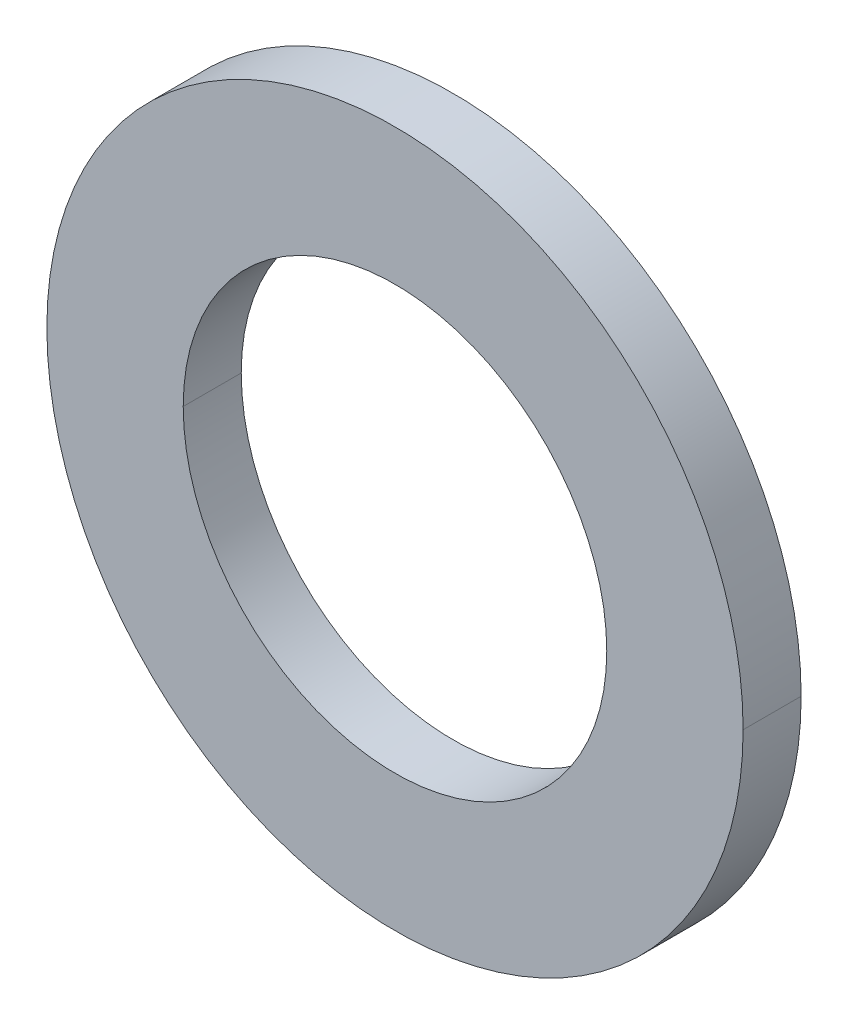
ISO-10303-21;
HEADER;
FILE_DESCRIPTION(('STEP AP214'),'2;1');
FILE_NAME('part.step','',(''),(''),'','','');
FILE_SCHEMA(('AUTOMOTIVE_DESIGN { 1 0 10303 214 1 1 1 1 }'));
ENDSEC;
DATA;
#1=APPLICATION_CONTEXT('core data for automotive mechanical design processes');
#2=APPLICATION_PROTOCOL_DEFINITION('international standard','automotive_design',2000,#1);
#3=PRODUCT_CONTEXT('',#1,'mechanical');
#4=PRODUCT('Part','Part','',(#3));
#5=PRODUCT_RELATED_PRODUCT_CATEGORY('part','',(#4));
#6=PRODUCT_DEFINITION_FORMATION('','',#4);
#7=PRODUCT_DEFINITION_CONTEXT('part definition',#1,'design');
#8=PRODUCT_DEFINITION('design','',#6,#7);
#9=PRODUCT_DEFINITION_SHAPE('','',#8);
#10=(LENGTH_UNIT() NAMED_UNIT(*) SI_UNIT(.MILLI.,.METRE.));
#11=(NAMED_UNIT(*) PLANE_ANGLE_UNIT() SI_UNIT($,.RADIAN.));
#12=(NAMED_UNIT(*) SI_UNIT($,.STERADIAN.) SOLID_ANGLE_UNIT());
#13=UNCERTAINTY_MEASURE_WITH_UNIT(LENGTH_MEASURE(1.E-05),#10,'distance_accuracy_value','');
#14=(GEOMETRIC_REPRESENTATION_CONTEXT(3) GLOBAL_UNCERTAINTY_ASSIGNED_CONTEXT((#13)) GLOBAL_UNIT_ASSIGNED_CONTEXT((#10,
#11,#12)) REPRESENTATION_CONTEXT('',''));
#15=CARTESIAN_POINT('',(0.,0.,0.));
#16=DIRECTION('',(0.,0.,1.));
#17=DIRECTION('',(1.,0.,0.));
#18=AXIS2_PLACEMENT_3D('',#15,#16,#17);
#19=CARTESIAN_POINT('',(-16.64701983,-23.770532578,1.));
#20=DIRECTION('',(0.,0.,1.));
#21=DIRECTION('',(1.,0.,0.));
#22=AXIS2_PLACEMENT_3D('',#19,#20,#21);
#23=PLANE('',#22);
#24=CARTESIAN_POINT('',(-11.08101983,-18.204532578,1.));
#25=DIRECTION('',(0.,0.,1.));
#26=DIRECTION('',(1.,0.,0.));
#27=AXIS2_PLACEMENT_3D('',#24,#25,#26);
#28=CIRCLE('',#27,3.65);
#29=CARTESIAN_POINT('',(-7.43101983,-18.204532578,1.));
#30=VERTEX_POINT('',#29);
#31=CARTESIAN_POINT('',(-14.73101983,-18.204532578,1.));
#32=VERTEX_POINT('',#31);
#33=EDGE_CURVE('E75',#30,#32,#28,.F.);
#34=ORIENTED_EDGE('',*,*,#33,.T.);
#35=CARTESIAN_POINT('',(-11.08101983,-18.204532578,1.));
#36=DIRECTION('',(0.,0.,1.));
#37=DIRECTION('',(1.,0.,0.));
#38=AXIS2_PLACEMENT_3D('',#35,#36,#37);
#39=CIRCLE('',#38,3.65);
#40=EDGE_CURVE('E71',#32,#30,#39,.F.);
#41=ORIENTED_EDGE('',*,*,#40,.T.);
#42=EDGE_LOOP('',(#34,#41));
#43=FACE_BOUND('',#42,.T.);
#44=CARTESIAN_POINT('',(-11.08101983,-18.204532578,1.));
#45=DIRECTION('',(0.,0.,1.));
#46=DIRECTION('',(1.,0.,0.));
#47=AXIS2_PLACEMENT_3D('',#44,#45,#46);
#48=CIRCLE('',#47,6.);
#49=CARTESIAN_POINT('',(-5.08101983,-18.204532578,1.));
#50=VERTEX_POINT('',#49);
#51=CARTESIAN_POINT('',(-17.08101983,-18.204532578,1.));
#52=VERTEX_POINT('',#51);
#53=EDGE_CURVE('E55',#50,#52,#48,.F.);
#54=ORIENTED_EDGE('',*,*,#53,.F.);
#55=CARTESIAN_POINT('',(-11.08101983,-18.204532578,1.));
#56=DIRECTION('',(0.,0.,1.));
#57=DIRECTION('',(1.,0.,0.));
#58=AXIS2_PLACEMENT_3D('',#55,#56,#57);
#59=CIRCLE('',#58,6.);
#60=EDGE_CURVE('E20',#52,#50,#59,.F.);
#61=ORIENTED_EDGE('',*,*,#60,.F.);
#62=EDGE_LOOP('',(#54,#61));
#63=FACE_BOUND('',#62,.T.);
#64=ADVANCED_FACE('F17',(#43,#63),#23,.T.);
#65=CARTESIAN_POINT('',(-11.08101983,-18.204532578,0.));
#66=DIRECTION('',(0.,0.,1.));
#67=DIRECTION('',(1.,0.,0.));
#68=AXIS2_PLACEMENT_3D('',#65,#66,#67);
#69=CYLINDRICAL_SURFACE('',#68,6.);
#70=DIRECTION('',(0.,0.,1.));
#71=VECTOR('',#70,1.);
#72=CARTESIAN_POINT('',(-5.08101983,-18.204532578,0.));
#73=LINE('',#72,#71);
#74=CARTESIAN_POINT('',(-5.08101983,-18.204532578,0.));
#75=VERTEX_POINT('',#74);
#76=EDGE_CURVE('E63',#75,#50,#73,.T.);
#77=ORIENTED_EDGE('',*,*,#76,.F.);
#78=CARTESIAN_POINT('',(-11.08101983,-18.204532578,0.));
#79=DIRECTION('',(0.,0.,1.));
#80=DIRECTION('',(1.,0.,0.));
#81=AXIS2_PLACEMENT_3D('',#78,#79,#80);
#82=CIRCLE('',#81,6.);
#83=CARTESIAN_POINT('',(-17.08101983,-18.204532578,0.));
#84=VERTEX_POINT('',#83);
#85=EDGE_CURVE('E79',#75,#84,#82,.T.);
#86=ORIENTED_EDGE('',*,*,#85,.T.);
#87=DIRECTION('',(0.,0.,1.));
#88=VECTOR('',#87,1.);
#89=CARTESIAN_POINT('',(-17.08101983,-18.204532578,0.));
#90=LINE('',#89,#88);
#91=EDGE_CURVE('E65',#52,#84,#90,.F.);
#92=ORIENTED_EDGE('',*,*,#91,.F.);
#93=ORIENTED_EDGE('',*,*,#60,.T.);
#94=EDGE_LOOP('',(#77,#86,#92,#93));
#95=FACE_BOUND('',#94,.T.);
#96=ADVANCED_FACE('F61',(#95),#69,.T.);
#97=CARTESIAN_POINT('',(-11.08101983,-18.204532578,0.));
#98=DIRECTION('',(0.,0.,1.));
#99=DIRECTION('',(1.,0.,0.));
#100=AXIS2_PLACEMENT_3D('',#97,#98,#99);
#101=CYLINDRICAL_SURFACE('',#100,6.);
#102=ORIENTED_EDGE('',*,*,#53,.T.);
#103=ORIENTED_EDGE('',*,*,#91,.T.);
#104=CARTESIAN_POINT('',(-11.08101983,-18.204532578,0.));
#105=DIRECTION('',(0.,0.,1.));
#106=DIRECTION('',(1.,0.,0.));
#107=AXIS2_PLACEMENT_3D('',#104,#105,#106);
#108=CIRCLE('',#107,6.);
#109=EDGE_CURVE('E69',#84,#75,#108,.T.);
#110=ORIENTED_EDGE('',*,*,#109,.T.);
#111=ORIENTED_EDGE('',*,*,#76,.T.);
#112=EDGE_LOOP('',(#102,#103,#110,#111));
#113=FACE_BOUND('',#112,.T.);
#114=ADVANCED_FACE('F67',(#113),#101,.T.);
#115=CARTESIAN_POINT('',(-11.08101983,-18.204532578,0.));
#116=DIRECTION('',(0.,0.,1.));
#117=DIRECTION('',(1.,0.,0.));
#118=AXIS2_PLACEMENT_3D('',#115,#116,#117);
#119=CYLINDRICAL_SURFACE('',#118,3.65);
#120=DIRECTION('',(0.,0.,1.));
#121=VECTOR('',#120,1.);
#122=CARTESIAN_POINT('',(-7.43101983,-18.204532578,0.));
#123=LINE('',#122,#121);
#124=CARTESIAN_POINT('',(-7.43101983,-18.204532578,0.));
#125=VERTEX_POINT('',#124);
#126=EDGE_CURVE('E34',#125,#30,#123,.T.);
#127=ORIENTED_EDGE('',*,*,#126,.T.);
#128=ORIENTED_EDGE('',*,*,#40,.F.);
#129=DIRECTION('',(0.,0.,1.));
#130=VECTOR('',#129,1.);
#131=CARTESIAN_POINT('',(-14.73101983,-18.204532578,0.));
#132=LINE('',#131,#130);
#133=CARTESIAN_POINT('',(-14.73101983,-18.204532578,0.));
#134=VERTEX_POINT('',#133);
#135=EDGE_CURVE('E78',#32,#134,#132,.F.);
#136=ORIENTED_EDGE('',*,*,#135,.T.);
#137=CARTESIAN_POINT('',(-11.08101983,-18.204532578,0.));
#138=DIRECTION('',(0.,0.,1.));
#139=DIRECTION('',(1.,0.,0.));
#140=AXIS2_PLACEMENT_3D('',#137,#138,#139);
#141=CIRCLE('',#140,3.65);
#142=EDGE_CURVE('E26',#134,#125,#141,.F.);
#143=ORIENTED_EDGE('',*,*,#142,.T.);
#144=EDGE_LOOP('',(#127,#128,#136,#143));
#145=FACE_BOUND('',#144,.T.);
#146=ADVANCED_FACE('F88',(#145),#119,.F.);
#147=CARTESIAN_POINT('',(-11.08101983,-18.204532578,0.));
#148=DIRECTION('',(0.,0.,1.));
#149=DIRECTION('',(1.,0.,0.));
#150=AXIS2_PLACEMENT_3D('',#147,#148,#149);
#151=CYLINDRICAL_SURFACE('',#150,3.65);
#152=ORIENTED_EDGE('',*,*,#33,.F.);
#153=ORIENTED_EDGE('',*,*,#126,.F.);
#154=CARTESIAN_POINT('',(-11.08101983,-18.204532578,0.));
#155=DIRECTION('',(0.,0.,1.));
#156=DIRECTION('',(1.,0.,0.));
#157=AXIS2_PLACEMENT_3D('',#154,#155,#156);
#158=CIRCLE('',#157,3.65);
#159=EDGE_CURVE('E11',#125,#134,#158,.F.);
#160=ORIENTED_EDGE('',*,*,#159,.T.);
#161=ORIENTED_EDGE('',*,*,#135,.F.);
#162=EDGE_LOOP('',(#152,#153,#160,#161));
#163=FACE_BOUND('',#162,.T.);
#164=ADVANCED_FACE('F89',(#163),#151,.F.);
#165=CARTESIAN_POINT('',(-16.64701983,-23.770532578,0.));
#166=DIRECTION('',(0.,0.,1.));
#167=DIRECTION('',(1.,0.,0.));
#168=AXIS2_PLACEMENT_3D('',#165,#166,#167);
#169=PLANE('',#168);
#170=ORIENTED_EDGE('',*,*,#142,.F.);
#171=ORIENTED_EDGE('',*,*,#159,.F.);
#172=EDGE_LOOP('',(#170,#171));
#173=FACE_BOUND('',#172,.T.);
#174=ORIENTED_EDGE('',*,*,#85,.F.);
#175=ORIENTED_EDGE('',*,*,#109,.F.);
#176=EDGE_LOOP('',(#174,#175));
#177=FACE_BOUND('',#176,.T.);
#178=ADVANCED_FACE('F91',(#173,#177),#169,.F.);
#179=CLOSED_SHELL('',(#64,#96,#114,#146,#164,#178));
#180=MANIFOLD_SOLID_BREP('B1',#179);
#181=ADVANCED_BREP_SHAPE_REPRESENTATION('',(#18,#180),#14);
#182=SHAPE_DEFINITION_REPRESENTATION(#9,#181);
ENDSEC;
END-ISO-10303-21;
